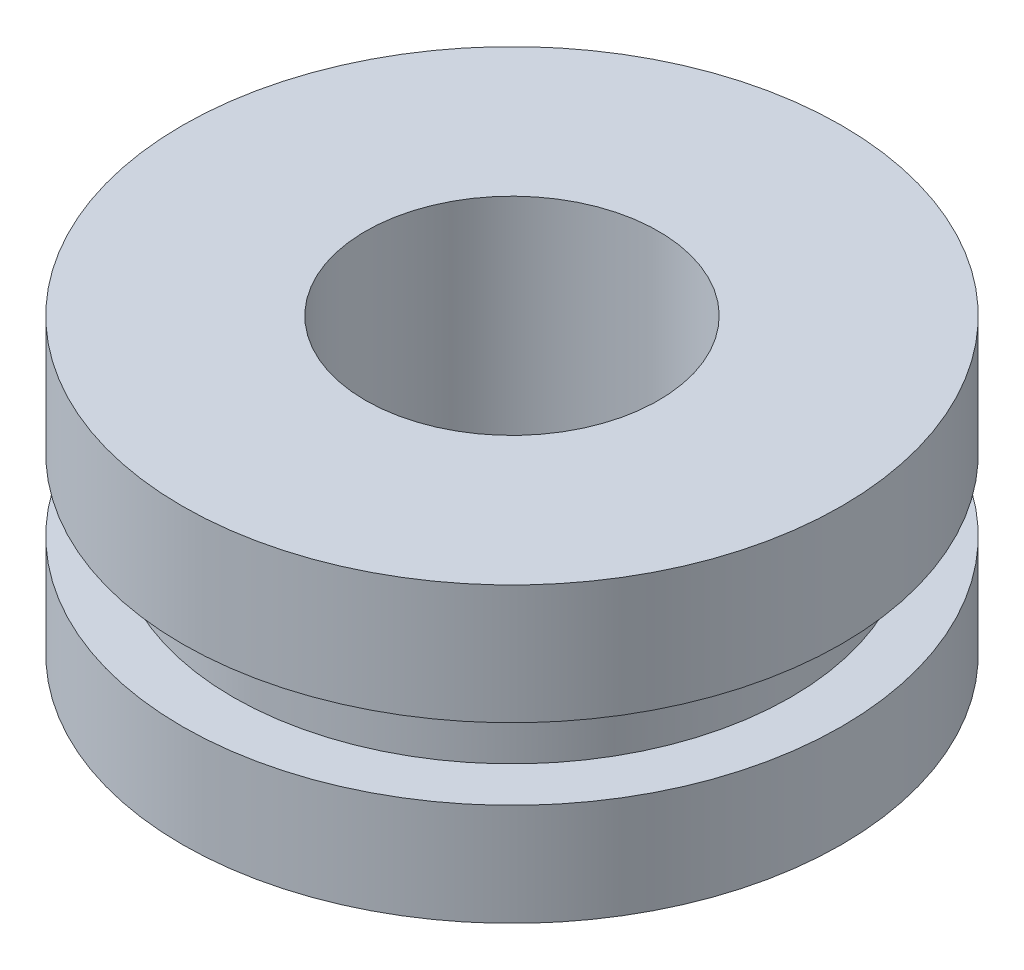
ISO-10303-21;
HEADER;
FILE_DESCRIPTION(('STEP AP214'),'2;1');
FILE_NAME('part.step','',(''),(''),'','','');
FILE_SCHEMA(('AUTOMOTIVE_DESIGN { 1 0 10303 214 1 1 1 1 }'));
ENDSEC;
DATA;
#1=APPLICATION_CONTEXT('core data for automotive mechanical design processes');
#2=APPLICATION_PROTOCOL_DEFINITION('international standard','automotive_design',2000,#1);
#3=PRODUCT_CONTEXT('',#1,'mechanical');
#4=PRODUCT('Part','Part','',(#3));
#5=PRODUCT_RELATED_PRODUCT_CATEGORY('part','',(#4));
#6=PRODUCT_DEFINITION_FORMATION('','',#4);
#7=PRODUCT_DEFINITION_CONTEXT('part definition',#1,'design');
#8=PRODUCT_DEFINITION('design','',#6,#7);
#9=PRODUCT_DEFINITION_SHAPE('','',#8);
#10=(LENGTH_UNIT() NAMED_UNIT(*) SI_UNIT(.MILLI.,.METRE.));
#11=(NAMED_UNIT(*) PLANE_ANGLE_UNIT() SI_UNIT($,.RADIAN.));
#12=(NAMED_UNIT(*) SI_UNIT($,.STERADIAN.) SOLID_ANGLE_UNIT());
#13=UNCERTAINTY_MEASURE_WITH_UNIT(LENGTH_MEASURE(1.E-05),#10,'distance_accuracy_value','');
#14=(GEOMETRIC_REPRESENTATION_CONTEXT(3) GLOBAL_UNCERTAINTY_ASSIGNED_CONTEXT((#13)) GLOBAL_UNIT_ASSIGNED_CONTEXT((#10,
#11,#12)) REPRESENTATION_CONTEXT('',''));
#15=CARTESIAN_POINT('',(0.,0.,0.));
#16=DIRECTION('',(0.,0.,1.));
#17=DIRECTION('',(1.,0.,0.));
#18=AXIS2_PLACEMENT_3D('',#15,#16,#17);
#19=CARTESIAN_POINT('',(0.,4.,0.));
#20=DIRECTION('',(0.,-1.,0.));
#21=DIRECTION('',(0.,0.,-1.));
#22=AXIS2_PLACEMENT_3D('',#19,#20,#21);
#23=CYLINDRICAL_SURFACE('',#22,4.5);
#24=CARTESIAN_POINT('',(0.,2.37132795063131,0.));
#25=DIRECTION('',(0.,1.,0.));
#26=DIRECTION('',(0.,0.,1.));
#27=AXIS2_PLACEMENT_3D('',#24,#25,#26);
#28=CIRCLE('',#27,4.5);
#29=CARTESIAN_POINT('',(0.,2.37132795063131,4.5));
#30=VERTEX_POINT('',#29);
#31=EDGE_CURVE('E49',#30,#30,#28,.T.);
#32=ORIENTED_EDGE('',*,*,#31,.T.);
#33=EDGE_LOOP('',(#32));
#34=FACE_BOUND('',#33,.T.);
#35=CARTESIAN_POINT('',(0.,4.,0.));
#36=DIRECTION('',(0.,1.,0.));
#37=DIRECTION('',(0.,0.,1.));
#38=AXIS2_PLACEMENT_3D('',#35,#36,#37);
#39=CIRCLE('',#38,4.5);
#40=CARTESIAN_POINT('',(0.,4.,4.5));
#41=VERTEX_POINT('',#40);
#42=EDGE_CURVE('E10',#41,#41,#39,.T.);
#43=ORIENTED_EDGE('',*,*,#42,.F.);
#44=EDGE_LOOP('',(#43));
#45=FACE_BOUND('',#44,.T.);
#46=ADVANCED_FACE('F33',(#34,#45),#23,.T.);
#47=CARTESIAN_POINT('',(0.,4.,0.));
#48=DIRECTION('',(0.,1.,0.));
#49=DIRECTION('',(0.,0.,1.));
#50=AXIS2_PLACEMENT_3D('',#47,#48,#49);
#51=PLANE('',#50);
#52=ORIENTED_EDGE('',*,*,#42,.T.);
#53=EDGE_LOOP('',(#52));
#54=FACE_BOUND('',#53,.T.);
#55=CARTESIAN_POINT('',(0.,4.,0.));
#56=DIRECTION('',(0.,1.,0.));
#57=DIRECTION('',(0.,0.,1.));
#58=AXIS2_PLACEMENT_3D('',#55,#56,#57);
#59=CIRCLE('',#58,2.);
#60=CARTESIAN_POINT('',(0.,4.,2.));
#61=VERTEX_POINT('',#60);
#62=EDGE_CURVE('E44',#61,#61,#59,.T.);
#63=ORIENTED_EDGE('',*,*,#62,.F.);
#64=EDGE_LOOP('',(#63));
#65=FACE_BOUND('',#64,.T.);
#66=ADVANCED_FACE('F74',(#54,#65),#51,.T.);
#67=CARTESIAN_POINT('',(0.,0.,0.));
#68=DIRECTION('',(0.,1.,0.));
#69=DIRECTION('',(0.,0.,1.));
#70=AXIS2_PLACEMENT_3D('',#67,#68,#69);
#71=PLANE('',#70);
#72=CARTESIAN_POINT('',(0.,0.,0.));
#73=DIRECTION('',(0.,1.,0.));
#74=DIRECTION('',(0.,0.,1.));
#75=AXIS2_PLACEMENT_3D('',#72,#73,#74);
#76=CIRCLE('',#75,4.5);
#77=CARTESIAN_POINT('',(0.,0.,4.5));
#78=VERTEX_POINT('',#77);
#79=EDGE_CURVE('E37',#78,#78,#76,.T.);
#80=ORIENTED_EDGE('',*,*,#79,.F.);
#81=EDGE_LOOP('',(#80));
#82=FACE_BOUND('',#81,.T.);
#83=CARTESIAN_POINT('',(0.,0.,0.));
#84=DIRECTION('',(0.,1.,0.));
#85=DIRECTION('',(0.,0.,1.));
#86=AXIS2_PLACEMENT_3D('',#83,#84,#85);
#87=CIRCLE('',#86,2.);
#88=CARTESIAN_POINT('',(0.,0.,2.));
#89=VERTEX_POINT('',#88);
#90=EDGE_CURVE('E46',#89,#89,#87,.T.);
#91=ORIENTED_EDGE('',*,*,#90,.T.);
#92=EDGE_LOOP('',(#91));
#93=FACE_BOUND('',#92,.T.);
#94=ADVANCED_FACE('F69',(#82,#93),#71,.F.);
#95=CARTESIAN_POINT('',(0.,1.39538843793237,0.));
#96=DIRECTION('',(0.,1.,0.));
#97=DIRECTION('',(0.,0.,1.));
#98=AXIS2_PLACEMENT_3D('',#95,#96,#97);
#99=CIRCLE('',#98,4.5);
#100=CARTESIAN_POINT('',(0.,1.39538843793237,4.5));
#101=VERTEX_POINT('',#100);
#102=EDGE_CURVE('E60',#101,#101,#99,.T.);
#103=ORIENTED_EDGE('',*,*,#102,.F.);
#104=EDGE_LOOP('',(#103));
#105=FACE_BOUND('',#104,.T.);
#106=ORIENTED_EDGE('',*,*,#79,.T.);
#107=EDGE_LOOP('',(#106));
#108=FACE_BOUND('',#107,.T.);
#109=ADVANCED_FACE('F35',(#105,#108),#23,.T.);
#110=CARTESIAN_POINT('',(0.,4.,0.));
#111=DIRECTION('',(0.,-1.,0.));
#112=DIRECTION('',(0.,0.,-1.));
#113=AXIS2_PLACEMENT_3D('',#110,#111,#112);
#114=CYLINDRICAL_SURFACE('',#113,2.);
#115=ORIENTED_EDGE('',*,*,#62,.T.);
#116=EDGE_LOOP('',(#115));
#117=FACE_BOUND('',#116,.T.);
#118=ORIENTED_EDGE('',*,*,#90,.F.);
#119=EDGE_LOOP('',(#118));
#120=FACE_BOUND('',#119,.T.);
#121=ADVANCED_FACE('F68',(#117,#120),#114,.F.);
#122=CARTESIAN_POINT('',(-4.5,2.37132795063131,0.));
#123=DIRECTION('',(0.,1.,0.));
#124=DIRECTION('',(0.,0.,1.));
#125=AXIS2_PLACEMENT_3D('',#122,#123,#124);
#126=PLANE('',#125);
#127=ORIENTED_EDGE('',*,*,#31,.F.);
#128=EDGE_LOOP('',(#127));
#129=FACE_BOUND('',#128,.T.);
#130=CARTESIAN_POINT('',(0.,2.37132795063131,0.));
#131=DIRECTION('',(0.,1.,0.));
#132=DIRECTION('',(0.,0.,1.));
#133=AXIS2_PLACEMENT_3D('',#130,#131,#132);
#134=CIRCLE('',#133,3.80677027313625);
#135=CARTESIAN_POINT('',(0.,2.37132795063131,3.80677027313625));
#136=VERTEX_POINT('',#135);
#137=EDGE_CURVE('E54',#136,#136,#134,.T.);
#138=ORIENTED_EDGE('',*,*,#137,.T.);
#139=EDGE_LOOP('',(#138));
#140=FACE_BOUND('',#139,.T.);
#141=ADVANCED_FACE('F78',(#129,#140),#126,.F.);
#142=CARTESIAN_POINT('',(0.,4.,0.));
#143=DIRECTION('',(0.,1.,0.));
#144=DIRECTION('',(0.,0.,1.));
#145=AXIS2_PLACEMENT_3D('',#142,#143,#144);
#146=CYLINDRICAL_SURFACE('',#145,3.80677027313625);
#147=ORIENTED_EDGE('',*,*,#137,.F.);
#148=EDGE_LOOP('',(#147));
#149=FACE_BOUND('',#148,.T.);
#150=CARTESIAN_POINT('',(0.,1.39538843793237,0.));
#151=DIRECTION('',(0.,1.,0.));
#152=DIRECTION('',(0.,0.,1.));
#153=AXIS2_PLACEMENT_3D('',#150,#151,#152);
#154=CIRCLE('',#153,3.80677027313625);
#155=CARTESIAN_POINT('',(0.,1.39538843793237,3.80677027313625));
#156=VERTEX_POINT('',#155);
#157=EDGE_CURVE('E57',#156,#156,#154,.T.);
#158=ORIENTED_EDGE('',*,*,#157,.T.);
#159=EDGE_LOOP('',(#158));
#160=FACE_BOUND('',#159,.T.);
#161=ADVANCED_FACE('F84',(#149,#160),#146,.T.);
#162=CARTESIAN_POINT('',(-3.80677027313625,1.39538843793237,0.));
#163=DIRECTION('',(0.,-1.,0.));
#164=DIRECTION('',(0.,0.,-1.));
#165=AXIS2_PLACEMENT_3D('',#162,#163,#164);
#166=PLANE('',#165);
#167=ORIENTED_EDGE('',*,*,#157,.F.);
#168=EDGE_LOOP('',(#167));
#169=FACE_BOUND('',#168,.T.);
#170=ORIENTED_EDGE('',*,*,#102,.T.);
#171=EDGE_LOOP('',(#170));
#172=FACE_BOUND('',#171,.T.);
#173=ADVANCED_FACE('F64',(#169,#172),#166,.F.);
#174=CLOSED_SHELL('',(#46,#66,#94,#109,#121,#141,#161,#173));
#175=MANIFOLD_SOLID_BREP('B2',#174);
#176=ADVANCED_BREP_SHAPE_REPRESENTATION('',(#18,#175),#14);
#177=SHAPE_DEFINITION_REPRESENTATION(#9,#176);
ENDSEC;
END-ISO-10303-21;
